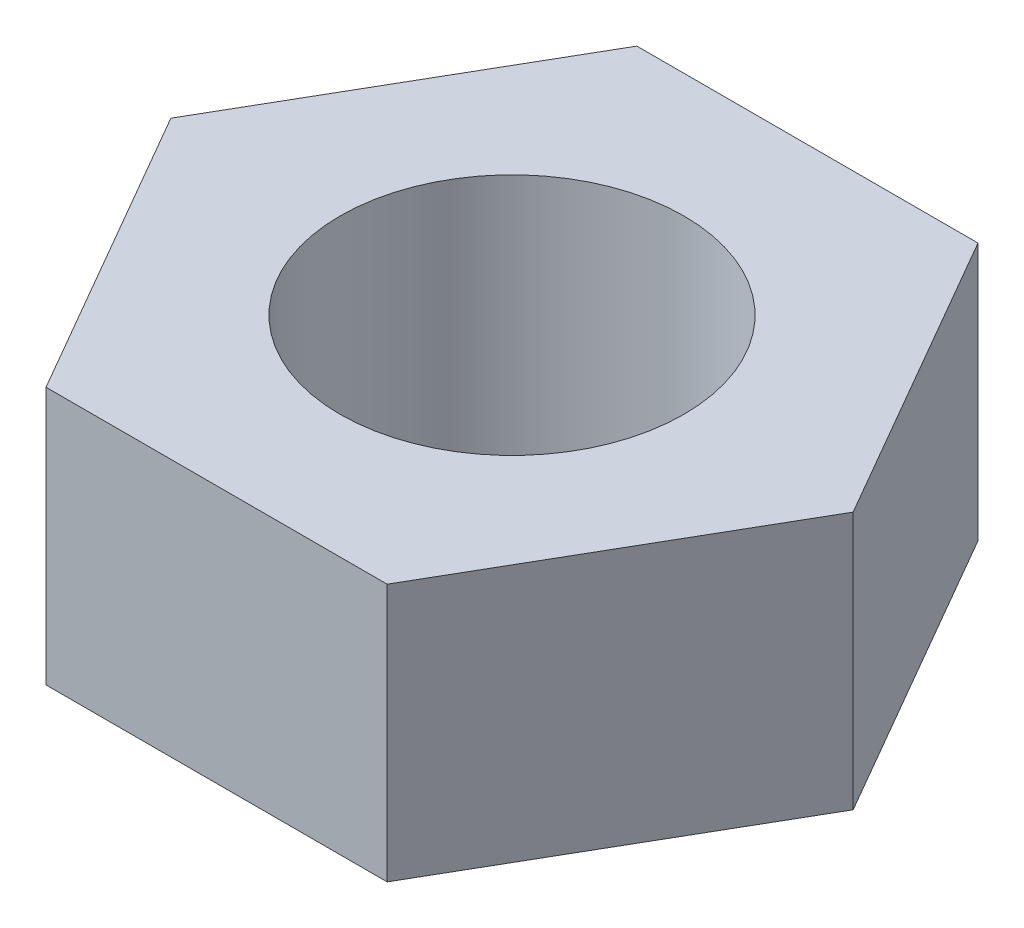
ISO-10303-21;
HEADER;
FILE_DESCRIPTION(('STEP AP214'),'2;1');
FILE_NAME('part.step','',(''),(''),'','','');
FILE_SCHEMA(('AUTOMOTIVE_DESIGN { 1 0 10303 214 1 1 1 1 }'));
ENDSEC;
DATA;
#1=APPLICATION_CONTEXT('core data for automotive mechanical design processes');
#2=APPLICATION_PROTOCOL_DEFINITION('international standard','automotive_design',2000,#1);
#3=PRODUCT_CONTEXT('',#1,'mechanical');
#4=PRODUCT('Part','Part','',(#3));
#5=PRODUCT_RELATED_PRODUCT_CATEGORY('part','',(#4));
#6=PRODUCT_DEFINITION_FORMATION('','',#4);
#7=PRODUCT_DEFINITION_CONTEXT('part definition',#1,'design');
#8=PRODUCT_DEFINITION('design','',#6,#7);
#9=PRODUCT_DEFINITION_SHAPE('','',#8);
#10=(LENGTH_UNIT() NAMED_UNIT(*) SI_UNIT(.MILLI.,.METRE.));
#11=(NAMED_UNIT(*) PLANE_ANGLE_UNIT() SI_UNIT($,.RADIAN.));
#12=(NAMED_UNIT(*) SI_UNIT($,.STERADIAN.) SOLID_ANGLE_UNIT());
#13=UNCERTAINTY_MEASURE_WITH_UNIT(LENGTH_MEASURE(1.E-05),#10,'distance_accuracy_value','');
#14=(GEOMETRIC_REPRESENTATION_CONTEXT(3) GLOBAL_UNCERTAINTY_ASSIGNED_CONTEXT((#13)) GLOBAL_UNIT_ASSIGNED_CONTEXT((#10,
#11,#12)) REPRESENTATION_CONTEXT('',''));
#15=CARTESIAN_POINT('',(0.,0.,0.));
#16=DIRECTION('',(0.,0.,1.));
#17=DIRECTION('',(1.,0.,0.));
#18=AXIS2_PLACEMENT_3D('',#15,#16,#17);
#19=CARTESIAN_POINT('',(0.,-157.5,0.));
#20=DIRECTION('',(0.,-1.,0.));
#21=DIRECTION('',(0.,0.,-1.));
#22=AXIS2_PLACEMENT_3D('',#19,#20,#21);
#23=PLANE('',#22);
#24=DIRECTION('',(-0.499999999999998,0.,-0.86602540378444));
#25=VECTOR('',#24,1.);
#26=CARTESIAN_POINT('',(-54.703938005717,-157.5,47.25));
#27=LINE('',#26,#25);
#28=CARTESIAN_POINT('',(-53.1162247654456,-157.5,50.));
#29=VERTEX_POINT('',#28);
#30=CARTESIAN_POINT('',(-54.703938005717,-157.5,47.25));
#31=VERTEX_POINT('',#30);
#32=EDGE_CURVE('E140',#29,#31,#27,.T.);
#33=ORIENTED_EDGE('',*,*,#32,.T.);
#34=DIRECTION('',(-1.,0.,0.));
#35=VECTOR('',#34,1.);
#36=CARTESIAN_POINT('',(-57.87936448626,-157.5,47.25));
#37=LINE('',#36,#35);
#38=CARTESIAN_POINT('',(-57.87936448626,-157.5,47.25));
#39=VERTEX_POINT('',#38);
#40=EDGE_CURVE('E92',#31,#39,#37,.T.);
#41=ORIENTED_EDGE('',*,*,#40,.T.);
#42=DIRECTION('',(-0.5,0.,0.866025403784438));
#43=VECTOR('',#42,1.);
#44=CARTESIAN_POINT('',(-59.4670777265315,-157.5,50.));
#45=LINE('',#44,#43);
#46=CARTESIAN_POINT('',(-59.4670777265315,-157.5,50.));
#47=VERTEX_POINT('',#46);
#48=EDGE_CURVE('E107',#39,#47,#45,.T.);
#49=ORIENTED_EDGE('',*,*,#48,.T.);
#50=DIRECTION('',(0.500000000000001,0.,0.866025403784438));
#51=VECTOR('',#50,1.);
#52=CARTESIAN_POINT('',(-57.87936448626,-157.5,52.75));
#53=LINE('',#52,#51);
#54=CARTESIAN_POINT('',(-57.87936448626,-157.5,52.75));
#55=VERTEX_POINT('',#54);
#56=EDGE_CURVE('E105',#47,#55,#53,.T.);
#57=ORIENTED_EDGE('',*,*,#56,.T.);
#58=DIRECTION('',(1.,0.,0.));
#59=VECTOR('',#58,1.);
#60=CARTESIAN_POINT('',(-54.7039380057171,-157.5,52.75));
#61=LINE('',#60,#59);
#62=CARTESIAN_POINT('',(-54.7039380057171,-157.5,52.75));
#63=VERTEX_POINT('',#62);
#64=EDGE_CURVE('E106',#55,#63,#61,.T.);
#65=ORIENTED_EDGE('',*,*,#64,.T.);
#66=DIRECTION('',(0.500000000000002,0.,-0.866025403784437));
#67=VECTOR('',#66,1.);
#68=CARTESIAN_POINT('',(-53.1162247654456,-157.5,50.));
#69=LINE('',#68,#67);
#70=EDGE_CURVE('E59',#63,#29,#69,.T.);
#71=ORIENTED_EDGE('',*,*,#70,.T.);
#72=EDGE_LOOP('',(#33,#41,#49,#57,#65,#71));
#73=FACE_BOUND('',#72,.T.);
#74=CARTESIAN_POINT('',(-56.2916512459885,-157.5,50.));
#75=DIRECTION('',(0.,1.,0.));
#76=DIRECTION('',(0.,0.,1.));
#77=AXIS2_PLACEMENT_3D('',#74,#75,#76);
#78=CIRCLE('',#77,1.6);
#79=CARTESIAN_POINT('',(-56.2916512459885,-157.5,51.6));
#80=VERTEX_POINT('',#79);
#81=EDGE_CURVE('E128',#80,#80,#78,.T.);
#82=ORIENTED_EDGE('',*,*,#81,.F.);
#83=EDGE_LOOP('',(#82));
#84=FACE_BOUND('',#83,.T.);
#85=ADVANCED_FACE('F41',(#73,#84),#23,.F.);
#86=CARTESIAN_POINT('',(0.,-159.9,0.));
#87=DIRECTION('',(0.,-1.,0.));
#88=DIRECTION('',(0.,0.,-1.));
#89=AXIS2_PLACEMENT_3D('',#86,#87,#88);
#90=PLANE('',#89);
#91=DIRECTION('',(-0.499999999999998,0.,-0.86602540378444));
#92=VECTOR('',#91,1.);
#93=CARTESIAN_POINT('',(-54.703938005717,-159.9,47.25));
#94=LINE('',#93,#92);
#95=CARTESIAN_POINT('',(-53.1162247654456,-159.9,50.));
#96=VERTEX_POINT('',#95);
#97=CARTESIAN_POINT('',(-54.703938005717,-159.9,47.25));
#98=VERTEX_POINT('',#97);
#99=EDGE_CURVE('E127',#96,#98,#94,.T.);
#100=ORIENTED_EDGE('',*,*,#99,.F.);
#101=DIRECTION('',(0.500000000000002,0.,-0.866025403784437));
#102=VECTOR('',#101,1.);
#103=CARTESIAN_POINT('',(-53.1162247654456,-159.9,50.));
#104=LINE('',#103,#102);
#105=CARTESIAN_POINT('',(-54.7039380057171,-159.9,52.75));
#106=VERTEX_POINT('',#105);
#107=EDGE_CURVE('E87',#106,#96,#104,.T.);
#108=ORIENTED_EDGE('',*,*,#107,.F.);
#109=DIRECTION('',(1.,0.,0.));
#110=VECTOR('',#109,1.);
#111=CARTESIAN_POINT('',(-54.7039380057171,-159.9,52.75));
#112=LINE('',#111,#110);
#113=CARTESIAN_POINT('',(-57.87936448626,-159.9,52.75));
#114=VERTEX_POINT('',#113);
#115=EDGE_CURVE('E82',#114,#106,#112,.T.);
#116=ORIENTED_EDGE('',*,*,#115,.F.);
#117=DIRECTION('',(0.500000000000001,0.,0.866025403784438));
#118=VECTOR('',#117,1.);
#119=CARTESIAN_POINT('',(-57.87936448626,-159.9,52.75));
#120=LINE('',#119,#118);
#121=CARTESIAN_POINT('',(-59.4670777265315,-159.9,50.));
#122=VERTEX_POINT('',#121);
#123=EDGE_CURVE('E119',#122,#114,#120,.T.);
#124=ORIENTED_EDGE('',*,*,#123,.F.);
#125=DIRECTION('',(-0.5,0.,0.866025403784438));
#126=VECTOR('',#125,1.);
#127=CARTESIAN_POINT('',(-59.4670777265315,-159.9,50.));
#128=LINE('',#127,#126);
#129=CARTESIAN_POINT('',(-57.87936448626,-159.9,47.25));
#130=VERTEX_POINT('',#129);
#131=EDGE_CURVE('E131',#130,#122,#128,.T.);
#132=ORIENTED_EDGE('',*,*,#131,.F.);
#133=DIRECTION('',(-1.,0.,0.));
#134=VECTOR('',#133,1.);
#135=CARTESIAN_POINT('',(-57.87936448626,-159.9,47.25));
#136=LINE('',#135,#134);
#137=EDGE_CURVE('E129',#98,#130,#136,.T.);
#138=ORIENTED_EDGE('',*,*,#137,.F.);
#139=EDGE_LOOP('',(#100,#108,#116,#124,#132,#138));
#140=FACE_BOUND('',#139,.T.);
#141=CARTESIAN_POINT('',(-56.2916512459885,-159.9,50.));
#142=DIRECTION('',(0.,1.,0.));
#143=DIRECTION('',(0.,0.,1.));
#144=AXIS2_PLACEMENT_3D('',#141,#142,#143);
#145=CIRCLE('',#144,1.6);
#146=CARTESIAN_POINT('',(-56.2916512459885,-159.9,51.6));
#147=VERTEX_POINT('',#146);
#148=EDGE_CURVE('E227',#147,#147,#145,.T.);
#149=ORIENTED_EDGE('',*,*,#148,.T.);
#150=EDGE_LOOP('',(#149));
#151=FACE_BOUND('',#150,.T.);
#152=ADVANCED_FACE('F148',(#140,#151),#90,.T.);
#153=CARTESIAN_POINT('',(-54.703938005717,-157.5,47.25));
#154=DIRECTION('',(-0.86602540378444,0.,0.499999999999998));
#155=DIRECTION('',(0.499999999999998,0.,0.86602540378444));
#156=AXIS2_PLACEMENT_3D('',#153,#154,#155);
#157=PLANE('',#156);
#158=ORIENTED_EDGE('',*,*,#99,.T.);
#159=DIRECTION('',(0.,-1.,0.));
#160=VECTOR('',#159,1.);
#161=CARTESIAN_POINT('',(-54.703938005717,-157.5,47.25));
#162=LINE('',#161,#160);
#163=EDGE_CURVE('E11',#31,#98,#162,.T.);
#164=ORIENTED_EDGE('',*,*,#163,.F.);
#165=ORIENTED_EDGE('',*,*,#32,.F.);
#166=DIRECTION('',(0.,-1.,0.));
#167=VECTOR('',#166,1.);
#168=CARTESIAN_POINT('',(-53.1162247654456,-157.5,50.));
#169=LINE('',#168,#167);
#170=EDGE_CURVE('E125',#29,#96,#169,.T.);
#171=ORIENTED_EDGE('',*,*,#170,.T.);
#172=EDGE_LOOP('',(#158,#164,#165,#171));
#173=FACE_BOUND('',#172,.T.);
#174=ADVANCED_FACE('F43',(#173),#157,.F.);
#175=CARTESIAN_POINT('',(-57.87936448626,-157.5,47.25));
#176=DIRECTION('',(0.,0.,1.));
#177=DIRECTION('',(1.,0.,0.));
#178=AXIS2_PLACEMENT_3D('',#175,#176,#177);
#179=PLANE('',#178);
#180=ORIENTED_EDGE('',*,*,#137,.T.);
#181=DIRECTION('',(0.,-1.,0.));
#182=VECTOR('',#181,1.);
#183=CARTESIAN_POINT('',(-57.87936448626,-157.5,47.25));
#184=LINE('',#183,#182);
#185=EDGE_CURVE('E49',#39,#130,#184,.T.);
#186=ORIENTED_EDGE('',*,*,#185,.F.);
#187=ORIENTED_EDGE('',*,*,#40,.F.);
#188=ORIENTED_EDGE('',*,*,#163,.T.);
#189=EDGE_LOOP('',(#180,#186,#187,#188));
#190=FACE_BOUND('',#189,.T.);
#191=ADVANCED_FACE('F174',(#190),#179,.F.);
#192=CARTESIAN_POINT('',(-59.4670777265315,-157.5,50.));
#193=DIRECTION('',(0.866025403784438,0.,0.5));
#194=DIRECTION('',(0.5,0.,-0.866025403784438));
#195=AXIS2_PLACEMENT_3D('',#192,#193,#194);
#196=PLANE('',#195);
#197=ORIENTED_EDGE('',*,*,#131,.T.);
#198=DIRECTION('',(0.,-1.,0.));
#199=VECTOR('',#198,1.);
#200=CARTESIAN_POINT('',(-59.4670777265315,-157.5,50.));
#201=LINE('',#200,#199);
#202=EDGE_CURVE('E116',#47,#122,#201,.T.);
#203=ORIENTED_EDGE('',*,*,#202,.F.);
#204=ORIENTED_EDGE('',*,*,#48,.F.);
#205=ORIENTED_EDGE('',*,*,#185,.T.);
#206=EDGE_LOOP('',(#197,#203,#204,#205));
#207=FACE_BOUND('',#206,.T.);
#208=ADVANCED_FACE('F141',(#207),#196,.F.);
#209=CARTESIAN_POINT('',(-57.87936448626,-157.5,52.75));
#210=DIRECTION('',(0.866025403784438,0.,-0.500000000000001));
#211=DIRECTION('',(-0.500000000000001,0.,-0.866025403784438));
#212=AXIS2_PLACEMENT_3D('',#209,#210,#211);
#213=PLANE('',#212);
#214=ORIENTED_EDGE('',*,*,#123,.T.);
#215=DIRECTION('',(0.,-1.,0.));
#216=VECTOR('',#215,1.);
#217=CARTESIAN_POINT('',(-57.87936448626,-157.5,52.75));
#218=LINE('',#217,#216);
#219=EDGE_CURVE('E114',#55,#114,#218,.T.);
#220=ORIENTED_EDGE('',*,*,#219,.F.);
#221=ORIENTED_EDGE('',*,*,#56,.F.);
#222=ORIENTED_EDGE('',*,*,#202,.T.);
#223=EDGE_LOOP('',(#214,#220,#221,#222));
#224=FACE_BOUND('',#223,.T.);
#225=ADVANCED_FACE('F111',(#224),#213,.F.);
#226=CARTESIAN_POINT('',(-54.7039380057171,-157.5,52.75));
#227=DIRECTION('',(0.,0.,-1.));
#228=DIRECTION('',(-1.,0.,0.));
#229=AXIS2_PLACEMENT_3D('',#226,#227,#228);
#230=PLANE('',#229);
#231=ORIENTED_EDGE('',*,*,#115,.T.);
#232=DIRECTION('',(0.,-1.,0.));
#233=VECTOR('',#232,1.);
#234=CARTESIAN_POINT('',(-54.7039380057171,-157.5,52.75));
#235=LINE('',#234,#233);
#236=EDGE_CURVE('E120',#63,#106,#235,.T.);
#237=ORIENTED_EDGE('',*,*,#236,.F.);
#238=ORIENTED_EDGE('',*,*,#64,.F.);
#239=ORIENTED_EDGE('',*,*,#219,.T.);
#240=EDGE_LOOP('',(#231,#237,#238,#239));
#241=FACE_BOUND('',#240,.T.);
#242=ADVANCED_FACE('F117',(#241),#230,.F.);
#243=CARTESIAN_POINT('',(-53.1162247654456,-157.5,50.));
#244=DIRECTION('',(-0.866025403784437,0.,-0.500000000000002));
#245=DIRECTION('',(-0.500000000000002,0.,0.866025403784437));
#246=AXIS2_PLACEMENT_3D('',#243,#244,#245);
#247=PLANE('',#246);
#248=ORIENTED_EDGE('',*,*,#107,.T.);
#249=ORIENTED_EDGE('',*,*,#170,.F.);
#250=ORIENTED_EDGE('',*,*,#70,.F.);
#251=ORIENTED_EDGE('',*,*,#236,.T.);
#252=EDGE_LOOP('',(#248,#249,#250,#251));
#253=FACE_BOUND('',#252,.T.);
#254=ADVANCED_FACE('F151',(#253),#247,.F.);
#255=CARTESIAN_POINT('',(-56.2916512459885,-157.5,50.));
#256=DIRECTION('',(0.,-1.,0.));
#257=DIRECTION('',(0.,0.,-1.));
#258=AXIS2_PLACEMENT_3D('',#255,#256,#257);
#259=CYLINDRICAL_SURFACE('',#258,1.6);
#260=ORIENTED_EDGE('',*,*,#81,.T.);
#261=EDGE_LOOP('',(#260));
#262=FACE_BOUND('',#261,.T.);
#263=ORIENTED_EDGE('',*,*,#148,.F.);
#264=EDGE_LOOP('',(#263));
#265=FACE_BOUND('',#264,.T.);
#266=ADVANCED_FACE('F153',(#262,#265),#259,.F.);
#267=CLOSED_SHELL('',(#85,#152,#174,#191,#208,#225,#242,#254,#266));
#268=MANIFOLD_SOLID_BREP('B2',#267);
#269=ADVANCED_BREP_SHAPE_REPRESENTATION('',(#18,#268),#14);
#270=SHAPE_DEFINITION_REPRESENTATION(#9,#269);
ENDSEC;
END-ISO-10303-21;
